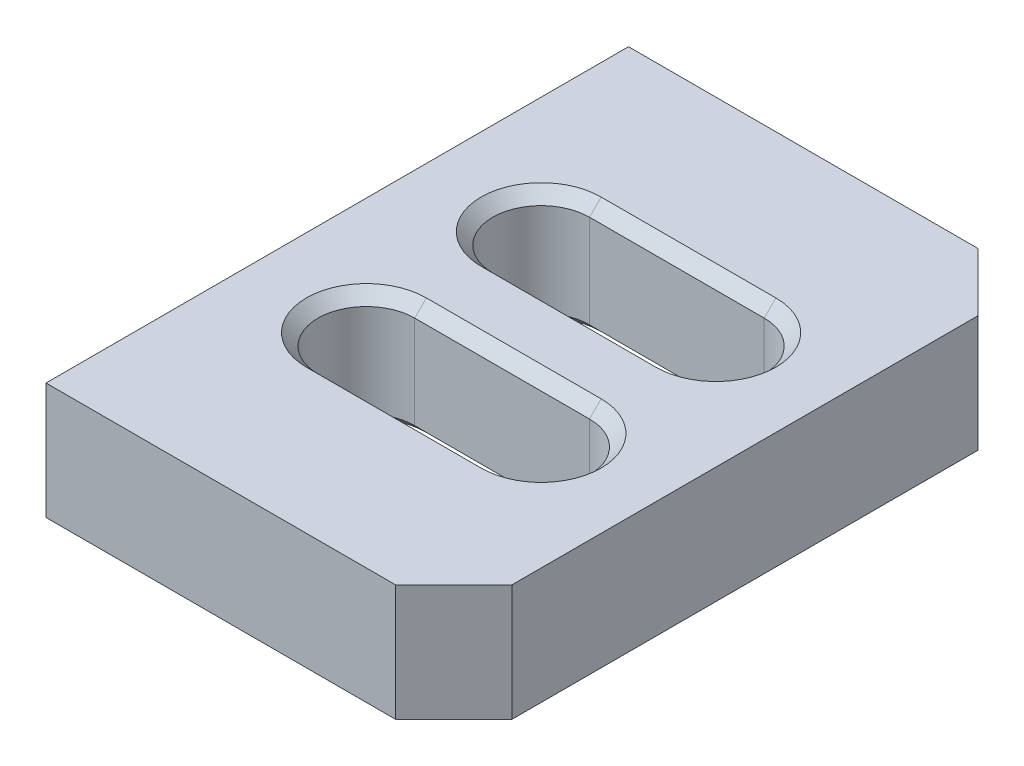
ISO-10303-21;
HEADER;
FILE_DESCRIPTION(('STEP AP214'),'2;1');
FILE_NAME('part.step','',(''),(''),'','','');
FILE_SCHEMA(('AUTOMOTIVE_DESIGN { 1 0 10303 214 1 1 1 1 }'));
ENDSEC;
DATA;
#1=APPLICATION_CONTEXT('core data for automotive mechanical design processes');
#2=APPLICATION_PROTOCOL_DEFINITION('international standard','automotive_design',2000,#1);
#3=PRODUCT_CONTEXT('',#1,'mechanical');
#4=PRODUCT('Part','Part','',(#3));
#5=PRODUCT_RELATED_PRODUCT_CATEGORY('part','',(#4));
#6=PRODUCT_DEFINITION_FORMATION('','',#4);
#7=PRODUCT_DEFINITION_CONTEXT('part definition',#1,'design');
#8=PRODUCT_DEFINITION('design','',#6,#7);
#9=PRODUCT_DEFINITION_SHAPE('','',#8);
#10=(LENGTH_UNIT() NAMED_UNIT(*) SI_UNIT(.MILLI.,.METRE.));
#11=(NAMED_UNIT(*) PLANE_ANGLE_UNIT() SI_UNIT($,.RADIAN.));
#12=(NAMED_UNIT(*) SI_UNIT($,.STERADIAN.) SOLID_ANGLE_UNIT());
#13=UNCERTAINTY_MEASURE_WITH_UNIT(LENGTH_MEASURE(1.E-05),#10,'distance_accuracy_value','');
#14=(GEOMETRIC_REPRESENTATION_CONTEXT(3) GLOBAL_UNCERTAINTY_ASSIGNED_CONTEXT((#13)) GLOBAL_UNIT_ASSIGNED_CONTEXT((#10,
#11,#12)) REPRESENTATION_CONTEXT('',''));
#15=CARTESIAN_POINT('',(0.,0.,0.));
#16=DIRECTION('',(0.,0.,1.));
#17=DIRECTION('',(1.,0.,0.));
#18=AXIS2_PLACEMENT_3D('',#15,#16,#17);
#19=CARTESIAN_POINT('',(35.,10.,-5.));
#20=DIRECTION('',(-0.707106781186547,0.,-0.707106781186548));
#21=DIRECTION('',(-0.707106781186548,0.,0.707106781186547));
#22=AXIS2_PLACEMENT_3D('',#19,#20,#21);
#23=PLANE('',#22);
#24=DIRECTION('',(0.707106781186548,0.,-0.707106781186547));
#25=VECTOR('',#24,1.);
#26=CARTESIAN_POINT('',(35.,10.,-5.));
#27=LINE('',#26,#25);
#28=CARTESIAN_POINT('',(30.,10.,0.));
#29=VERTEX_POINT('',#28);
#30=CARTESIAN_POINT('',(35.,10.,-5.));
#31=VERTEX_POINT('',#30);
#32=EDGE_CURVE('E405',#29,#31,#27,.T.);
#33=ORIENTED_EDGE('',*,*,#32,.F.);
#34=DIRECTION('',(0.,1.,0.));
#35=VECTOR('',#34,1.);
#36=CARTESIAN_POINT('',(30.,10.,0.));
#37=LINE('',#36,#35);
#38=CARTESIAN_POINT('',(30.,0.,0.));
#39=VERTEX_POINT('',#38);
#40=EDGE_CURVE('E368',#39,#29,#37,.T.);
#41=ORIENTED_EDGE('',*,*,#40,.F.);
#42=DIRECTION('',(-0.707106781186548,0.,0.707106781186547));
#43=VECTOR('',#42,1.);
#44=CARTESIAN_POINT('',(15.,0.,15.));
#45=LINE('',#44,#43);
#46=CARTESIAN_POINT('',(35.,0.,-5.));
#47=VERTEX_POINT('',#46);
#48=EDGE_CURVE('E437',#47,#39,#45,.T.);
#49=ORIENTED_EDGE('',*,*,#48,.F.);
#50=DIRECTION('',(0.,-1.,0.));
#51=VECTOR('',#50,1.);
#52=CARTESIAN_POINT('',(35.,10.,-5.));
#53=LINE('',#52,#51);
#54=EDGE_CURVE('E353',#31,#47,#53,.T.);
#55=ORIENTED_EDGE('',*,*,#54,.F.);
#56=EDGE_LOOP('',(#33,#41,#49,#55));
#57=FACE_BOUND('',#56,.T.);
#58=ADVANCED_FACE('F17',(#57),#23,.F.);
#59=CARTESIAN_POINT('',(30.,10.,-50.));
#60=DIRECTION('',(-0.707106781186549,0.,0.707106781186546));
#61=DIRECTION('',(0.,1.,0.));
#62=AXIS2_PLACEMENT_3D('',#59,#60,#61);
#63=PLANE('',#62);
#64=DIRECTION('',(-0.707106781186546,0.,-0.707106781186549));
#65=VECTOR('',#64,1.);
#66=CARTESIAN_POINT('',(30.,10.,-50.));
#67=LINE('',#66,#65);
#68=CARTESIAN_POINT('',(35.,10.,-45.));
#69=VERTEX_POINT('',#68);
#70=CARTESIAN_POINT('',(30.,10.,-50.));
#71=VERTEX_POINT('',#70);
#72=EDGE_CURVE('E266',#69,#71,#67,.T.);
#73=ORIENTED_EDGE('',*,*,#72,.F.);
#74=DIRECTION('',(0.,1.,0.));
#75=VECTOR('',#74,1.);
#76=CARTESIAN_POINT('',(35.,10.,-45.));
#77=LINE('',#76,#75);
#78=CARTESIAN_POINT('',(35.,0.,-45.));
#79=VERTEX_POINT('',#78);
#80=EDGE_CURVE('E298',#79,#69,#77,.T.);
#81=ORIENTED_EDGE('',*,*,#80,.F.);
#82=DIRECTION('',(0.707106781186546,0.,0.707106781186549));
#83=VECTOR('',#82,1.);
#84=CARTESIAN_POINT('',(40.,0.,-40.));
#85=LINE('',#84,#83);
#86=CARTESIAN_POINT('',(30.,0.,-50.));
#87=VERTEX_POINT('',#86);
#88=EDGE_CURVE('E441',#87,#79,#85,.T.);
#89=ORIENTED_EDGE('',*,*,#88,.F.);
#90=DIRECTION('',(0.,-1.,0.));
#91=VECTOR('',#90,1.);
#92=CARTESIAN_POINT('',(30.,10.,-50.));
#93=LINE('',#92,#91);
#94=EDGE_CURVE('E262',#71,#87,#93,.T.);
#95=ORIENTED_EDGE('',*,*,#94,.F.);
#96=EDGE_LOOP('',(#73,#81,#89,#95));
#97=FACE_BOUND('',#96,.T.);
#98=ADVANCED_FACE('F618',(#97),#63,.F.);
#99=CARTESIAN_POINT('',(10.,9.,-32.5));
#100=DIRECTION('',(0.,1.,0.));
#101=DIRECTION('',(0.,0.,1.));
#102=AXIS2_PLACEMENT_3D('',#99,#100,#101);
#103=CONICAL_SURFACE('',#102,4.15,0.785398163397452);
#104=DIRECTION('',(0.,0.707106781186546,-0.707106781186549));
#105=VECTOR('',#104,1.);
#106=CARTESIAN_POINT('',(10.,9.,-36.65));
#107=LINE('',#106,#105);
#108=CARTESIAN_POINT('',(10.,9.,-36.65));
#109=VERTEX_POINT('',#108);
#110=CARTESIAN_POINT('',(10.,10.,-37.65));
#111=VERTEX_POINT('',#110);
#112=EDGE_CURVE('E26',#109,#111,#107,.T.);
#113=ORIENTED_EDGE('',*,*,#112,.T.);
#114=CARTESIAN_POINT('',(10.,10.,-32.5));
#115=DIRECTION('',(0.,-1.,0.));
#116=DIRECTION('',(0.,0.,-1.));
#117=AXIS2_PLACEMENT_3D('',#114,#115,#116);
#118=CIRCLE('',#117,5.15);
#119=CARTESIAN_POINT('',(10.,10.,-27.35));
#120=VERTEX_POINT('',#119);
#121=EDGE_CURVE('E399',#120,#111,#118,.T.);
#122=ORIENTED_EDGE('',*,*,#121,.F.);
#123=DIRECTION('',(0.,-0.707106781186545,-0.70710678118655));
#124=VECTOR('',#123,1.);
#125=CARTESIAN_POINT('',(10.,10.,-27.35));
#126=LINE('',#125,#124);
#127=CARTESIAN_POINT('',(10.,9.,-28.35));
#128=VERTEX_POINT('',#127);
#129=EDGE_CURVE('E11',#120,#128,#126,.T.);
#130=ORIENTED_EDGE('',*,*,#129,.T.);
#131=CARTESIAN_POINT('',(10.,9.,-32.5));
#132=DIRECTION('',(0.,1.,0.));
#133=DIRECTION('',(0.,0.,-1.));
#134=AXIS2_PLACEMENT_3D('',#131,#132,#133);
#135=CIRCLE('',#134,4.15);
#136=EDGE_CURVE('E292',#109,#128,#135,.T.);
#137=ORIENTED_EDGE('',*,*,#136,.F.);
#138=EDGE_LOOP('',(#113,#122,#130,#137));
#139=FACE_BOUND('',#138,.T.);
#140=ADVANCED_FACE('F599',(#139),#103,.F.);
#141=CARTESIAN_POINT('',(25.,9.,-28.35));
#142=DIRECTION('',(0.,-0.70710678118655,0.707106781186545));
#143=DIRECTION('',(-1.,0.,0.));
#144=AXIS2_PLACEMENT_3D('',#141,#142,#143);
#145=PLANE('',#144);
#146=DIRECTION('',(0.,-0.707106781186545,-0.70710678118655));
#147=VECTOR('',#146,1.);
#148=CARTESIAN_POINT('',(25.,10.,-27.35));
#149=LINE('',#148,#147);
#150=CARTESIAN_POINT('',(25.,10.,-27.35));
#151=VERTEX_POINT('',#150);
#152=CARTESIAN_POINT('',(25.,9.,-28.35));
#153=VERTEX_POINT('',#152);
#154=EDGE_CURVE('E20',#151,#153,#149,.T.);
#155=ORIENTED_EDGE('',*,*,#154,.T.);
#156=DIRECTION('',(1.,0.,0.));
#157=VECTOR('',#156,1.);
#158=CARTESIAN_POINT('',(25.,9.,-28.35));
#159=LINE('',#158,#157);
#160=EDGE_CURVE('E398',#128,#153,#159,.T.);
#161=ORIENTED_EDGE('',*,*,#160,.F.);
#162=ORIENTED_EDGE('',*,*,#129,.F.);
#163=DIRECTION('',(-1.,0.,0.));
#164=VECTOR('',#163,1.);
#165=CARTESIAN_POINT('',(0.,10.,-27.35));
#166=LINE('',#165,#164);
#167=EDGE_CURVE('E404',#151,#120,#166,.T.);
#168=ORIENTED_EDGE('',*,*,#167,.F.);
#169=EDGE_LOOP('',(#155,#161,#162,#168));
#170=FACE_BOUND('',#169,.T.);
#171=ADVANCED_FACE('F567',(#170),#145,.F.);
#172=CARTESIAN_POINT('',(25.,9.,-36.65));
#173=DIRECTION('',(0.,-0.707106781186548,-0.707106781186547));
#174=DIRECTION('',(0.,0.707106781186547,-0.707106781186548));
#175=AXIS2_PLACEMENT_3D('',#172,#173,#174);
#176=PLANE('',#175);
#177=DIRECTION('',(0.,0.707106781186546,-0.707106781186549));
#178=VECTOR('',#177,1.);
#179=CARTESIAN_POINT('',(25.,9.,-36.65));
#180=LINE('',#179,#178);
#181=CARTESIAN_POINT('',(25.,9.,-36.65));
#182=VERTEX_POINT('',#181);
#183=CARTESIAN_POINT('',(25.,10.,-37.65));
#184=VERTEX_POINT('',#183);
#185=EDGE_CURVE('E464',#182,#184,#180,.T.);
#186=ORIENTED_EDGE('',*,*,#185,.T.);
#187=DIRECTION('',(1.,0.,0.));
#188=VECTOR('',#187,1.);
#189=CARTESIAN_POINT('',(0.,10.,-37.65));
#190=LINE('',#189,#188);
#191=EDGE_CURVE('E403',#111,#184,#190,.T.);
#192=ORIENTED_EDGE('',*,*,#191,.F.);
#193=ORIENTED_EDGE('',*,*,#112,.F.);
#194=DIRECTION('',(-1.,0.,0.));
#195=VECTOR('',#194,1.);
#196=CARTESIAN_POINT('',(25.,9.,-36.65));
#197=LINE('',#196,#195);
#198=EDGE_CURVE('E433',#182,#109,#197,.T.);
#199=ORIENTED_EDGE('',*,*,#198,.F.);
#200=EDGE_LOOP('',(#186,#192,#193,#199));
#201=FACE_BOUND('',#200,.T.);
#202=ADVANCED_FACE('F650',(#201),#176,.F.);
#203=CARTESIAN_POINT('',(25.,9.,-32.5));
#204=DIRECTION('',(0.,1.,0.));
#205=DIRECTION('',(0.,0.,1.));
#206=AXIS2_PLACEMENT_3D('',#203,#204,#205);
#207=CONICAL_SURFACE('',#206,4.15,0.785398163397452);
#208=ORIENTED_EDGE('',*,*,#154,.F.);
#209=CARTESIAN_POINT('',(25.,10.,-32.5));
#210=DIRECTION('',(0.,-1.,0.));
#211=DIRECTION('',(0.,0.,-1.));
#212=AXIS2_PLACEMENT_3D('',#209,#210,#211);
#213=CIRCLE('',#212,5.15);
#214=EDGE_CURVE('E442',#184,#151,#213,.T.);
#215=ORIENTED_EDGE('',*,*,#214,.F.);
#216=ORIENTED_EDGE('',*,*,#185,.F.);
#217=CARTESIAN_POINT('',(25.,9.,-32.5));
#218=DIRECTION('',(0.,1.,0.));
#219=DIRECTION('',(0.,0.,-1.));
#220=AXIS2_PLACEMENT_3D('',#217,#218,#219);
#221=CIRCLE('',#220,4.15);
#222=EDGE_CURVE('E360',#153,#182,#221,.T.);
#223=ORIENTED_EDGE('',*,*,#222,.F.);
#224=EDGE_LOOP('',(#208,#215,#216,#223));
#225=FACE_BOUND('',#224,.T.);
#226=ADVANCED_FACE('F575',(#225),#207,.F.);
#227=CARTESIAN_POINT('',(10.,9.,-17.5));
#228=DIRECTION('',(0.,1.,0.));
#229=DIRECTION('',(0.,0.,1.));
#230=AXIS2_PLACEMENT_3D('',#227,#228,#229);
#231=CONICAL_SURFACE('',#230,4.15,0.785398163397452);
#232=DIRECTION('',(0.,0.707106781186545,-0.70710678118655));
#233=VECTOR('',#232,1.);
#234=CARTESIAN_POINT('',(10.,9.,-21.65));
#235=LINE('',#234,#233);
#236=CARTESIAN_POINT('',(10.,9.,-21.65));
#237=VERTEX_POINT('',#236);
#238=CARTESIAN_POINT('',(10.,10.,-22.65));
#239=VERTEX_POINT('',#238);
#240=EDGE_CURVE('E519',#237,#239,#235,.T.);
#241=ORIENTED_EDGE('',*,*,#240,.T.);
#242=CARTESIAN_POINT('',(10.,10.,-17.5));
#243=DIRECTION('',(0.,-1.,0.));
#244=DIRECTION('',(0.,0.,-1.));
#245=AXIS2_PLACEMENT_3D('',#242,#243,#244);
#246=CIRCLE('',#245,5.15);
#247=CARTESIAN_POINT('',(10.,10.,-12.35));
#248=VERTEX_POINT('',#247);
#249=EDGE_CURVE('E416',#248,#239,#246,.T.);
#250=ORIENTED_EDGE('',*,*,#249,.F.);
#251=DIRECTION('',(0.,-0.707106781186545,-0.70710678118655));
#252=VECTOR('',#251,1.);
#253=CARTESIAN_POINT('',(10.,10.,-12.35));
#254=LINE('',#253,#252);
#255=CARTESIAN_POINT('',(10.,9.,-13.35));
#256=VERTEX_POINT('',#255);
#257=EDGE_CURVE('E554',#248,#256,#254,.T.);
#258=ORIENTED_EDGE('',*,*,#257,.T.);
#259=CARTESIAN_POINT('',(10.,9.,-17.5));
#260=DIRECTION('',(0.,1.,0.));
#261=DIRECTION('',(0.,0.,-1.));
#262=AXIS2_PLACEMENT_3D('',#259,#260,#261);
#263=CIRCLE('',#262,4.15);
#264=EDGE_CURVE('E421',#237,#256,#263,.T.);
#265=ORIENTED_EDGE('',*,*,#264,.F.);
#266=EDGE_LOOP('',(#241,#250,#258,#265));
#267=FACE_BOUND('',#266,.T.);
#268=ADVANCED_FACE('F653',(#267),#231,.F.);
#269=CARTESIAN_POINT('',(25.,9.,-13.35));
#270=DIRECTION('',(0.,-0.70710678118655,0.707106781186545));
#271=DIRECTION('',(-1.,0.,0.));
#272=AXIS2_PLACEMENT_3D('',#269,#270,#271);
#273=PLANE('',#272);
#274=DIRECTION('',(0.,-0.707106781186545,-0.70710678118655));
#275=VECTOR('',#274,1.);
#276=CARTESIAN_POINT('',(25.,10.,-12.35));
#277=LINE('',#276,#275);
#278=CARTESIAN_POINT('',(25.,10.,-12.35));
#279=VERTEX_POINT('',#278);
#280=CARTESIAN_POINT('',(25.,9.,-13.35));
#281=VERTEX_POINT('',#280);
#282=EDGE_CURVE('E520',#279,#281,#277,.T.);
#283=ORIENTED_EDGE('',*,*,#282,.T.);
#284=DIRECTION('',(1.,0.,0.));
#285=VECTOR('',#284,1.);
#286=CARTESIAN_POINT('',(25.,9.,-13.35));
#287=LINE('',#286,#285);
#288=EDGE_CURVE('E328',#256,#281,#287,.T.);
#289=ORIENTED_EDGE('',*,*,#288,.F.);
#290=ORIENTED_EDGE('',*,*,#257,.F.);
#291=DIRECTION('',(-1.,0.,0.));
#292=VECTOR('',#291,1.);
#293=CARTESIAN_POINT('',(0.,10.,-12.35));
#294=LINE('',#293,#292);
#295=EDGE_CURVE('E408',#279,#248,#294,.T.);
#296=ORIENTED_EDGE('',*,*,#295,.F.);
#297=EDGE_LOOP('',(#283,#289,#290,#296));
#298=FACE_BOUND('',#297,.T.);
#299=ADVANCED_FACE('F656',(#298),#273,.F.);
#300=CARTESIAN_POINT('',(25.,9.,-21.65));
#301=DIRECTION('',(0.,-0.70710678118655,-0.707106781186546));
#302=DIRECTION('',(0.,0.707106781186546,-0.70710678118655));
#303=AXIS2_PLACEMENT_3D('',#300,#301,#302);
#304=PLANE('',#303);
#305=DIRECTION('',(0.,0.707106781186545,-0.70710678118655));
#306=VECTOR('',#305,1.);
#307=CARTESIAN_POINT('',(25.,9.,-21.65));
#308=LINE('',#307,#306);
#309=CARTESIAN_POINT('',(25.,9.,-21.65));
#310=VERTEX_POINT('',#309);
#311=CARTESIAN_POINT('',(25.,10.,-22.65));
#312=VERTEX_POINT('',#311);
#313=EDGE_CURVE('E516',#310,#312,#308,.T.);
#314=ORIENTED_EDGE('',*,*,#313,.T.);
#315=DIRECTION('',(1.,0.,0.));
#316=VECTOR('',#315,1.);
#317=CARTESIAN_POINT('',(0.,10.,-22.65));
#318=LINE('',#317,#316);
#319=EDGE_CURVE('E420',#239,#312,#318,.T.);
#320=ORIENTED_EDGE('',*,*,#319,.F.);
#321=ORIENTED_EDGE('',*,*,#240,.F.);
#322=DIRECTION('',(-1.,0.,0.));
#323=VECTOR('',#322,1.);
#324=CARTESIAN_POINT('',(25.,9.,-21.65));
#325=LINE('',#324,#323);
#326=EDGE_CURVE('E533',#310,#237,#325,.T.);
#327=ORIENTED_EDGE('',*,*,#326,.F.);
#328=EDGE_LOOP('',(#314,#320,#321,#327));
#329=FACE_BOUND('',#328,.T.);
#330=ADVANCED_FACE('F659',(#329),#304,.F.);
#331=CARTESIAN_POINT('',(25.,9.,-17.5));
#332=DIRECTION('',(0.,1.,0.));
#333=DIRECTION('',(0.,0.,1.));
#334=AXIS2_PLACEMENT_3D('',#331,#332,#333);
#335=CONICAL_SURFACE('',#334,4.15,0.785398163397452);
#336=ORIENTED_EDGE('',*,*,#282,.F.);
#337=CARTESIAN_POINT('',(25.,10.,-17.5));
#338=DIRECTION('',(0.,-1.,0.));
#339=DIRECTION('',(0.,0.,-1.));
#340=AXIS2_PLACEMENT_3D('',#337,#338,#339);
#341=CIRCLE('',#340,5.15);
#342=EDGE_CURVE('E412',#312,#279,#341,.T.);
#343=ORIENTED_EDGE('',*,*,#342,.F.);
#344=ORIENTED_EDGE('',*,*,#313,.F.);
#345=CARTESIAN_POINT('',(25.,9.,-17.5));
#346=DIRECTION('',(0.,1.,0.));
#347=DIRECTION('',(0.,0.,-1.));
#348=AXIS2_PLACEMENT_3D('',#345,#346,#347);
#349=CIRCLE('',#348,4.15);
#350=EDGE_CURVE('E358',#281,#310,#349,.T.);
#351=ORIENTED_EDGE('',*,*,#350,.F.);
#352=EDGE_LOOP('',(#336,#343,#344,#351));
#353=FACE_BOUND('',#352,.T.);
#354=ADVANCED_FACE('F663',(#353),#335,.F.);
#355=CARTESIAN_POINT('',(25.,1.,-28.35));
#356=DIRECTION('',(0.,-0.707106781186552,-0.707106781186543));
#357=DIRECTION('',(0.,0.707106781186543,-0.707106781186552));
#358=AXIS2_PLACEMENT_3D('',#355,#356,#357);
#359=PLANE('',#358);
#360=DIRECTION('',(0.,-0.707106781186544,0.707106781186552));
#361=VECTOR('',#360,1.);
#362=CARTESIAN_POINT('',(25.,1.,-28.35));
#363=LINE('',#362,#361);
#364=CARTESIAN_POINT('',(25.,1.,-28.35));
#365=VERTEX_POINT('',#364);
#366=CARTESIAN_POINT('',(25.,0.,-27.35));
#367=VERTEX_POINT('',#366);
#368=EDGE_CURVE('E345',#365,#367,#363,.T.);
#369=ORIENTED_EDGE('',*,*,#368,.T.);
#370=DIRECTION('',(1.,0.,0.));
#371=VECTOR('',#370,1.);
#372=CARTESIAN_POINT('',(25.,0.,-27.35));
#373=LINE('',#372,#371);
#374=CARTESIAN_POINT('',(10.,0.,-27.35));
#375=VERTEX_POINT('',#374);
#376=EDGE_CURVE('E468',#375,#367,#373,.T.);
#377=ORIENTED_EDGE('',*,*,#376,.F.);
#378=DIRECTION('',(0.,0.707106781186542,-0.707106781186553));
#379=VECTOR('',#378,1.);
#380=CARTESIAN_POINT('',(10.,0.,-27.35));
#381=LINE('',#380,#379);
#382=CARTESIAN_POINT('',(10.,1.,-28.35));
#383=VERTEX_POINT('',#382);
#384=EDGE_CURVE('E348',#375,#383,#381,.T.);
#385=ORIENTED_EDGE('',*,*,#384,.T.);
#386=DIRECTION('',(-1.,0.,0.));
#387=VECTOR('',#386,1.);
#388=CARTESIAN_POINT('',(10.,1.,-28.35));
#389=LINE('',#388,#387);
#390=EDGE_CURVE('E364',#365,#383,#389,.T.);
#391=ORIENTED_EDGE('',*,*,#390,.F.);
#392=EDGE_LOOP('',(#369,#377,#385,#391));
#393=FACE_BOUND('',#392,.T.);
#394=ADVANCED_FACE('F588',(#393),#359,.T.);
#395=CARTESIAN_POINT('',(10.,1.,-32.5));
#396=DIRECTION('',(0.,-1.,0.));
#397=DIRECTION('',(0.,0.,-1.));
#398=AXIS2_PLACEMENT_3D('',#395,#396,#397);
#399=CONICAL_SURFACE('',#398,4.15,0.785398163397455);
#400=DIRECTION('',(0.,0.707106781186545,0.70710678118655));
#401=VECTOR('',#400,1.);
#402=CARTESIAN_POINT('',(10.,0.,-37.65));
#403=LINE('',#402,#401);
#404=CARTESIAN_POINT('',(10.,0.,-37.65));
#405=VERTEX_POINT('',#404);
#406=CARTESIAN_POINT('',(10.,1.,-36.65));
#407=VERTEX_POINT('',#406);
#408=EDGE_CURVE('E544',#405,#407,#403,.T.);
#409=ORIENTED_EDGE('',*,*,#408,.T.);
#410=CARTESIAN_POINT('',(10.,1.,-32.5));
#411=DIRECTION('',(0.,-1.,0.));
#412=DIRECTION('',(0.,0.,-1.));
#413=AXIS2_PLACEMENT_3D('',#410,#411,#412);
#414=CIRCLE('',#413,4.15);
#415=EDGE_CURVE('E307',#383,#407,#414,.T.);
#416=ORIENTED_EDGE('',*,*,#415,.F.);
#417=ORIENTED_EDGE('',*,*,#384,.F.);
#418=CARTESIAN_POINT('',(10.,0.,-32.5));
#419=DIRECTION('',(0.,1.,0.));
#420=DIRECTION('',(0.,0.,-1.));
#421=AXIS2_PLACEMENT_3D('',#418,#419,#420);
#422=CIRCLE('',#421,5.15);
#423=EDGE_CURVE('E388',#405,#375,#422,.T.);
#424=ORIENTED_EDGE('',*,*,#423,.F.);
#425=EDGE_LOOP('',(#409,#416,#417,#424));
#426=FACE_BOUND('',#425,.T.);
#427=ADVANCED_FACE('F592',(#426),#399,.F.);
#428=CARTESIAN_POINT('',(25.,1.,-32.5));
#429=DIRECTION('',(0.,-1.,0.));
#430=DIRECTION('',(0.,0.,-1.));
#431=AXIS2_PLACEMENT_3D('',#428,#429,#430);
#432=CONICAL_SURFACE('',#431,4.15,0.785398163397454);
#433=DIRECTION('',(0.,-0.707106781186545,-0.70710678118655));
#434=VECTOR('',#433,1.);
#435=CARTESIAN_POINT('',(25.,1.,-36.65));
#436=LINE('',#435,#434);
#437=CARTESIAN_POINT('',(25.,1.,-36.65));
#438=VERTEX_POINT('',#437);
#439=CARTESIAN_POINT('',(25.,0.,-37.65));
#440=VERTEX_POINT('',#439);
#441=EDGE_CURVE('E349',#438,#440,#436,.T.);
#442=ORIENTED_EDGE('',*,*,#441,.T.);
#443=CARTESIAN_POINT('',(25.,0.,-32.5));
#444=DIRECTION('',(0.,1.,0.));
#445=DIRECTION('',(0.,0.,-1.));
#446=AXIS2_PLACEMENT_3D('',#443,#444,#445);
#447=CIRCLE('',#446,5.15);
#448=EDGE_CURVE('E472',#367,#440,#447,.T.);
#449=ORIENTED_EDGE('',*,*,#448,.F.);
#450=ORIENTED_EDGE('',*,*,#368,.F.);
#451=CARTESIAN_POINT('',(25.,1.,-32.5));
#452=DIRECTION('',(0.,-1.,0.));
#453=DIRECTION('',(0.,0.,-1.));
#454=AXIS2_PLACEMENT_3D('',#451,#452,#453);
#455=CIRCLE('',#454,4.15);
#456=EDGE_CURVE('E314',#438,#365,#455,.T.);
#457=ORIENTED_EDGE('',*,*,#456,.F.);
#458=EDGE_LOOP('',(#442,#449,#450,#457));
#459=FACE_BOUND('',#458,.T.);
#460=ADVANCED_FACE('F582',(#459),#432,.F.);
#461=CARTESIAN_POINT('',(25.,1.,-36.65));
#462=DIRECTION('',(0.,-0.70710678118655,0.707106781186546));
#463=DIRECTION('',(-1.,0.,0.));
#464=AXIS2_PLACEMENT_3D('',#461,#462,#463);
#465=PLANE('',#464);
#466=ORIENTED_EDGE('',*,*,#408,.F.);
#467=DIRECTION('',(-1.,0.,0.));
#468=VECTOR('',#467,1.);
#469=CARTESIAN_POINT('',(10.,0.,-37.65));
#470=LINE('',#469,#468);
#471=EDGE_CURVE('E476',#440,#405,#470,.T.);
#472=ORIENTED_EDGE('',*,*,#471,.F.);
#473=ORIENTED_EDGE('',*,*,#441,.F.);
#474=DIRECTION('',(1.,0.,0.));
#475=VECTOR('',#474,1.);
#476=CARTESIAN_POINT('',(25.,1.,-36.65));
#477=LINE('',#476,#475);
#478=EDGE_CURVE('E295',#407,#438,#477,.T.);
#479=ORIENTED_EDGE('',*,*,#478,.F.);
#480=EDGE_LOOP('',(#466,#472,#473,#479));
#481=FACE_BOUND('',#480,.T.);
#482=ADVANCED_FACE('F672',(#481),#465,.T.);
#483=CARTESIAN_POINT('',(25.,1.,-13.35));
#484=DIRECTION('',(0.,-0.707106781186552,-0.707106781186544));
#485=DIRECTION('',(0.,0.707106781186544,-0.707106781186552));
#486=AXIS2_PLACEMENT_3D('',#483,#484,#485);
#487=PLANE('',#486);
#488=DIRECTION('',(0.,-0.707106781186544,0.707106781186552));
#489=VECTOR('',#488,1.);
#490=CARTESIAN_POINT('',(25.,1.,-13.35));
#491=LINE('',#490,#489);
#492=CARTESIAN_POINT('',(25.,1.,-13.35));
#493=VERTEX_POINT('',#492);
#494=CARTESIAN_POINT('',(25.,0.,-12.35));
#495=VERTEX_POINT('',#494);
#496=EDGE_CURVE('E376',#493,#495,#491,.T.);
#497=ORIENTED_EDGE('',*,*,#496,.T.);
#498=DIRECTION('',(1.,0.,0.));
#499=VECTOR('',#498,1.);
#500=CARTESIAN_POINT('',(25.,0.,-12.35));
#501=LINE('',#500,#499);
#502=CARTESIAN_POINT('',(10.,0.,-12.35));
#503=VERTEX_POINT('',#502);
#504=EDGE_CURVE('E451',#503,#495,#501,.T.);
#505=ORIENTED_EDGE('',*,*,#504,.F.);
#506=DIRECTION('',(0.,0.707106781186544,-0.707106781186551));
#507=VECTOR('',#506,1.);
#508=CARTESIAN_POINT('',(10.,0.,-12.35));
#509=LINE('',#508,#507);
#510=CARTESIAN_POINT('',(10.,1.,-13.35));
#511=VERTEX_POINT('',#510);
#512=EDGE_CURVE('E541',#503,#511,#509,.T.);
#513=ORIENTED_EDGE('',*,*,#512,.T.);
#514=DIRECTION('',(-1.,0.,0.));
#515=VECTOR('',#514,1.);
#516=CARTESIAN_POINT('',(10.,1.,-13.35));
#517=LINE('',#516,#515);
#518=EDGE_CURVE('E452',#493,#511,#517,.T.);
#519=ORIENTED_EDGE('',*,*,#518,.F.);
#520=EDGE_LOOP('',(#497,#505,#513,#519));
#521=FACE_BOUND('',#520,.T.);
#522=ADVANCED_FACE('F675',(#521),#487,.T.);
#523=CARTESIAN_POINT('',(10.,1.,-17.5));
#524=DIRECTION('',(0.,-1.,0.));
#525=DIRECTION('',(0.,0.,-1.));
#526=AXIS2_PLACEMENT_3D('',#523,#524,#525);
#527=CONICAL_SURFACE('',#526,4.15,0.785398163397453);
#528=DIRECTION('',(0.,0.707106781186544,0.707106781186552));
#529=VECTOR('',#528,1.);
#530=CARTESIAN_POINT('',(10.,0.,-22.65));
#531=LINE('',#530,#529);
#532=CARTESIAN_POINT('',(10.,0.,-22.65));
#533=VERTEX_POINT('',#532);
#534=CARTESIAN_POINT('',(10.,1.,-21.65));
#535=VERTEX_POINT('',#534);
#536=EDGE_CURVE('E377',#533,#535,#531,.T.);
#537=ORIENTED_EDGE('',*,*,#536,.T.);
#538=CARTESIAN_POINT('',(10.,1.,-17.5));
#539=DIRECTION('',(0.,-1.,0.));
#540=DIRECTION('',(0.,0.,-1.));
#541=AXIS2_PLACEMENT_3D('',#538,#539,#540);
#542=CIRCLE('',#541,4.15);
#543=EDGE_CURVE('E323',#511,#535,#542,.T.);
#544=ORIENTED_EDGE('',*,*,#543,.F.);
#545=ORIENTED_EDGE('',*,*,#512,.F.);
#546=CARTESIAN_POINT('',(10.,0.,-17.5));
#547=DIRECTION('',(0.,1.,0.));
#548=DIRECTION('',(0.,0.,-1.));
#549=AXIS2_PLACEMENT_3D('',#546,#547,#548);
#550=CIRCLE('',#549,5.15);
#551=EDGE_CURVE('E440',#533,#503,#550,.T.);
#552=ORIENTED_EDGE('',*,*,#551,.F.);
#553=EDGE_LOOP('',(#537,#544,#545,#552));
#554=FACE_BOUND('',#553,.T.);
#555=ADVANCED_FACE('F681',(#554),#527,.F.);
#556=CARTESIAN_POINT('',(25.,1.,-17.5));
#557=DIRECTION('',(0.,-1.,0.));
#558=DIRECTION('',(0.,0.,-1.));
#559=AXIS2_PLACEMENT_3D('',#556,#557,#558);
#560=CONICAL_SURFACE('',#559,4.15,0.785398163397454);
#561=DIRECTION('',(0.,-0.707106781186544,-0.707106781186552));
#562=VECTOR('',#561,1.);
#563=CARTESIAN_POINT('',(25.,1.,-21.65));
#564=LINE('',#563,#562);
#565=CARTESIAN_POINT('',(25.,1.,-21.65));
#566=VERTEX_POINT('',#565);
#567=CARTESIAN_POINT('',(25.,0.,-22.65));
#568=VERTEX_POINT('',#567);
#569=EDGE_CURVE('E373',#566,#568,#564,.T.);
#570=ORIENTED_EDGE('',*,*,#569,.T.);
#571=CARTESIAN_POINT('',(25.,0.,-17.5));
#572=DIRECTION('',(0.,1.,0.));
#573=DIRECTION('',(0.,0.,-1.));
#574=AXIS2_PLACEMENT_3D('',#571,#572,#573);
#575=CIRCLE('',#574,5.15);
#576=EDGE_CURVE('E389',#495,#568,#575,.T.);
#577=ORIENTED_EDGE('',*,*,#576,.F.);
#578=ORIENTED_EDGE('',*,*,#496,.F.);
#579=CARTESIAN_POINT('',(25.,1.,-17.5));
#580=DIRECTION('',(0.,-1.,0.));
#581=DIRECTION('',(0.,0.,-1.));
#582=AXIS2_PLACEMENT_3D('',#579,#580,#581);
#583=CIRCLE('',#582,4.15);
#584=EDGE_CURVE('E359',#566,#493,#583,.T.);
#585=ORIENTED_EDGE('',*,*,#584,.F.);
#586=EDGE_LOOP('',(#570,#577,#578,#585));
#587=FACE_BOUND('',#586,.T.);
#588=ADVANCED_FACE('F685',(#587),#560,.F.);
#589=CARTESIAN_POINT('',(25.,1.,-21.65));
#590=DIRECTION('',(0.,-0.707106781186551,0.707106781186544));
#591=DIRECTION('',(-1.,0.,0.));
#592=AXIS2_PLACEMENT_3D('',#589,#590,#591);
#593=PLANE('',#592);
#594=ORIENTED_EDGE('',*,*,#536,.F.);
#595=DIRECTION('',(-1.,0.,0.));
#596=VECTOR('',#595,1.);
#597=CARTESIAN_POINT('',(10.,0.,-22.65));
#598=LINE('',#597,#596);
#599=EDGE_CURVE('E384',#568,#533,#598,.T.);
#600=ORIENTED_EDGE('',*,*,#599,.F.);
#601=ORIENTED_EDGE('',*,*,#569,.F.);
#602=DIRECTION('',(1.,0.,0.));
#603=VECTOR('',#602,1.);
#604=CARTESIAN_POINT('',(25.,1.,-21.65));
#605=LINE('',#604,#603);
#606=EDGE_CURVE('E425',#535,#566,#605,.T.);
#607=ORIENTED_EDGE('',*,*,#606,.F.);
#608=EDGE_LOOP('',(#594,#600,#601,#607));
#609=FACE_BOUND('',#608,.T.);
#610=ADVANCED_FACE('F689',(#609),#593,.T.);
#611=CARTESIAN_POINT('',(25.,-2.,-21.65));
#612=DIRECTION('',(0.,0.,-1.));
#613=DIRECTION('',(-1.,0.,0.));
#614=AXIS2_PLACEMENT_3D('',#611,#612,#613);
#615=PLANE('',#614);
#616=DIRECTION('',(0.,1.,0.));
#617=VECTOR('',#616,1.);
#618=CARTESIAN_POINT('',(10.,-2.,-21.65));
#619=LINE('',#618,#617);
#620=EDGE_CURVE('E327',#535,#237,#619,.T.);
#621=ORIENTED_EDGE('',*,*,#620,.F.);
#622=ORIENTED_EDGE('',*,*,#606,.T.);
#623=DIRECTION('',(0.,1.,0.));
#624=VECTOR('',#623,1.);
#625=CARTESIAN_POINT('',(25.,-2.,-21.65));
#626=LINE('',#625,#624);
#627=EDGE_CURVE('E429',#566,#310,#626,.T.);
#628=ORIENTED_EDGE('',*,*,#627,.T.);
#629=ORIENTED_EDGE('',*,*,#326,.T.);
#630=EDGE_LOOP('',(#621,#622,#628,#629));
#631=FACE_BOUND('',#630,.T.);
#632=ADVANCED_FACE('F693',(#631),#615,.F.);
#633=CARTESIAN_POINT('',(10.,-2.,-17.5));
#634=DIRECTION('',(0.,1.,0.));
#635=DIRECTION('',(0.,0.,1.));
#636=AXIS2_PLACEMENT_3D('',#633,#634,#635);
#637=CYLINDRICAL_SURFACE('',#636,4.15);
#638=DIRECTION('',(0.,1.,0.));
#639=VECTOR('',#638,1.);
#640=CARTESIAN_POINT('',(10.,-2.,-13.35));
#641=LINE('',#640,#639);
#642=EDGE_CURVE('E342',#511,#256,#641,.T.);
#643=ORIENTED_EDGE('',*,*,#642,.F.);
#644=ORIENTED_EDGE('',*,*,#543,.T.);
#645=ORIENTED_EDGE('',*,*,#620,.T.);
#646=ORIENTED_EDGE('',*,*,#264,.T.);
#647=EDGE_LOOP('',(#643,#644,#645,#646));
#648=FACE_BOUND('',#647,.T.);
#649=ADVANCED_FACE('F697',(#648),#637,.F.);
#650=CARTESIAN_POINT('',(25.,-2.,-13.35));
#651=DIRECTION('',(0.,0.,1.));
#652=DIRECTION('',(1.,0.,0.));
#653=AXIS2_PLACEMENT_3D('',#650,#651,#652);
#654=PLANE('',#653);
#655=DIRECTION('',(0.,1.,0.));
#656=VECTOR('',#655,1.);
#657=CARTESIAN_POINT('',(25.,-2.,-13.35));
#658=LINE('',#657,#656);
#659=EDGE_CURVE('E354',#493,#281,#658,.T.);
#660=ORIENTED_EDGE('',*,*,#659,.F.);
#661=ORIENTED_EDGE('',*,*,#518,.T.);
#662=ORIENTED_EDGE('',*,*,#642,.T.);
#663=ORIENTED_EDGE('',*,*,#288,.T.);
#664=EDGE_LOOP('',(#660,#661,#662,#663));
#665=FACE_BOUND('',#664,.T.);
#666=ADVANCED_FACE('F701',(#665),#654,.F.);
#667=CARTESIAN_POINT('',(25.,-2.,-17.5));
#668=DIRECTION('',(0.,1.,0.));
#669=DIRECTION('',(0.,0.,1.));
#670=AXIS2_PLACEMENT_3D('',#667,#668,#669);
#671=CYLINDRICAL_SURFACE('',#670,4.15);
#672=ORIENTED_EDGE('',*,*,#627,.F.);
#673=ORIENTED_EDGE('',*,*,#584,.T.);
#674=ORIENTED_EDGE('',*,*,#659,.T.);
#675=ORIENTED_EDGE('',*,*,#350,.T.);
#676=EDGE_LOOP('',(#672,#673,#674,#675));
#677=FACE_BOUND('',#676,.T.);
#678=ADVANCED_FACE('F705',(#677),#671,.F.);
#679=CARTESIAN_POINT('',(25.,-2.,-36.65));
#680=DIRECTION('',(0.,0.,-1.));
#681=DIRECTION('',(-1.,0.,0.));
#682=AXIS2_PLACEMENT_3D('',#679,#680,#681);
#683=PLANE('',#682);
#684=DIRECTION('',(0.,1.,0.));
#685=VECTOR('',#684,1.);
#686=CARTESIAN_POINT('',(10.,-2.,-36.65));
#687=LINE('',#686,#685);
#688=EDGE_CURVE('E296',#407,#109,#687,.T.);
#689=ORIENTED_EDGE('',*,*,#688,.F.);
#690=ORIENTED_EDGE('',*,*,#478,.T.);
#691=DIRECTION('',(0.,1.,0.));
#692=VECTOR('',#691,1.);
#693=CARTESIAN_POINT('',(25.,-2.,-36.65));
#694=LINE('',#693,#692);
#695=EDGE_CURVE('E310',#438,#182,#694,.T.);
#696=ORIENTED_EDGE('',*,*,#695,.T.);
#697=ORIENTED_EDGE('',*,*,#198,.T.);
#698=EDGE_LOOP('',(#689,#690,#696,#697));
#699=FACE_BOUND('',#698,.T.);
#700=ADVANCED_FACE('F709',(#699),#683,.F.);
#701=CARTESIAN_POINT('',(10.,-2.,-32.5));
#702=DIRECTION('',(0.,1.,0.));
#703=DIRECTION('',(0.,0.,1.));
#704=AXIS2_PLACEMENT_3D('',#701,#702,#703);
#705=CYLINDRICAL_SURFACE('',#704,4.15);
#706=DIRECTION('',(0.,1.,0.));
#707=VECTOR('',#706,1.);
#708=CARTESIAN_POINT('',(10.,-2.,-28.35));
#709=LINE('',#708,#707);
#710=EDGE_CURVE('E498',#383,#128,#709,.T.);
#711=ORIENTED_EDGE('',*,*,#710,.F.);
#712=ORIENTED_EDGE('',*,*,#415,.T.);
#713=ORIENTED_EDGE('',*,*,#688,.T.);
#714=ORIENTED_EDGE('',*,*,#136,.T.);
#715=EDGE_LOOP('',(#711,#712,#713,#714));
#716=FACE_BOUND('',#715,.T.);
#717=ADVANCED_FACE('F595',(#716),#705,.F.);
#718=CARTESIAN_POINT('',(25.,-2.,-28.35));
#719=DIRECTION('',(0.,0.,1.));
#720=DIRECTION('',(1.,0.,0.));
#721=AXIS2_PLACEMENT_3D('',#718,#719,#720);
#722=PLANE('',#721);
#723=DIRECTION('',(0.,1.,0.));
#724=VECTOR('',#723,1.);
#725=CARTESIAN_POINT('',(25.,-2.,-28.35));
#726=LINE('',#725,#724);
#727=EDGE_CURVE('E365',#365,#153,#726,.T.);
#728=ORIENTED_EDGE('',*,*,#727,.F.);
#729=ORIENTED_EDGE('',*,*,#390,.T.);
#730=ORIENTED_EDGE('',*,*,#710,.T.);
#731=ORIENTED_EDGE('',*,*,#160,.T.);
#732=EDGE_LOOP('',(#728,#729,#730,#731));
#733=FACE_BOUND('',#732,.T.);
#734=ADVANCED_FACE('F573',(#733),#722,.F.);
#735=CARTESIAN_POINT('',(25.,-2.,-32.5));
#736=DIRECTION('',(0.,1.,0.));
#737=DIRECTION('',(0.,0.,1.));
#738=AXIS2_PLACEMENT_3D('',#735,#736,#737);
#739=CYLINDRICAL_SURFACE('',#738,4.15);
#740=ORIENTED_EDGE('',*,*,#695,.F.);
#741=ORIENTED_EDGE('',*,*,#456,.T.);
#742=ORIENTED_EDGE('',*,*,#727,.T.);
#743=ORIENTED_EDGE('',*,*,#222,.T.);
#744=EDGE_LOOP('',(#740,#741,#742,#743));
#745=FACE_BOUND('',#744,.T.);
#746=ADVANCED_FACE('F579',(#745),#739,.F.);
#747=CARTESIAN_POINT('',(0.,5.,-25.));
#748=DIRECTION('',(-1.,0.,0.));
#749=DIRECTION('',(0.,0.,1.));
#750=AXIS2_PLACEMENT_3D('',#747,#748,#749);
#751=CONICAL_SURFACE('',#750,3.025,0.78539816339745);
#752=CARTESIAN_POINT('',(0.525,5.,-25.));
#753=DIRECTION('',(-1.,0.,0.));
#754=DIRECTION('',(0.,0.,1.));
#755=AXIS2_PLACEMENT_3D('',#752,#753,#754);
#756=CIRCLE('',#755,2.5);
#757=CARTESIAN_POINT('',(0.525,5.,-22.5));
#758=VERTEX_POINT('',#757);
#759=EDGE_CURVE('E315',#758,#758,#756,.T.);
#760=ORIENTED_EDGE('',*,*,#759,.F.);
#761=EDGE_LOOP('',(#760));
#762=FACE_BOUND('',#761,.T.);
#763=CARTESIAN_POINT('',(0.,5.,-25.));
#764=DIRECTION('',(-1.,0.,0.));
#765=DIRECTION('',(0.,0.,1.));
#766=AXIS2_PLACEMENT_3D('',#763,#764,#765);
#767=CIRCLE('',#766,3.025);
#768=CARTESIAN_POINT('',(0.,5.,-21.975));
#769=VERTEX_POINT('',#768);
#770=EDGE_CURVE('E276',#769,#769,#767,.T.);
#771=ORIENTED_EDGE('',*,*,#770,.T.);
#772=EDGE_LOOP('',(#771));
#773=FACE_BOUND('',#772,.T.);
#774=ADVANCED_FACE('F722',(#762,#773),#751,.F.);
#775=CARTESIAN_POINT('',(0.,5.,-25.));
#776=DIRECTION('',(-1.,0.,0.));
#777=DIRECTION('',(0.,0.,1.));
#778=AXIS2_PLACEMENT_3D('',#775,#776,#777);
#779=CYLINDRICAL_SURFACE('',#778,2.5);
#780=CARTESIAN_POINT('',(20.,5.,-25.));
#781=DIRECTION('',(-1.,0.,0.));
#782=DIRECTION('',(0.,0.,1.));
#783=AXIS2_PLACEMENT_3D('',#780,#781,#782);
#784=CIRCLE('',#783,2.5);
#785=CARTESIAN_POINT('',(20.,5.,-22.5));
#786=VERTEX_POINT('',#785);
#787=EDGE_CURVE('E318',#786,#786,#784,.T.);
#788=ORIENTED_EDGE('',*,*,#787,.F.);
#789=EDGE_LOOP('',(#788));
#790=FACE_BOUND('',#789,.T.);
#791=ORIENTED_EDGE('',*,*,#759,.T.);
#792=EDGE_LOOP('',(#791));
#793=FACE_BOUND('',#792,.T.);
#794=ADVANCED_FACE('F718',(#790,#793),#779,.F.);
#795=CARTESIAN_POINT('',(20.,5.,-25.));
#796=DIRECTION('',(-1.,0.,0.));
#797=DIRECTION('',(0.,0.,1.));
#798=AXIS2_PLACEMENT_3D('',#795,#796,#797);
#799=CONICAL_SURFACE('',#798,2.5,1.02974425867665);
#800=CARTESIAN_POINT('',(21.5021515475689,5.,-25.));
#801=VERTEX_POINT('',#800);
#802=VERTEX_LOOP('',#801);
#803=FACE_BOUND('',#802,.T.);
#804=ORIENTED_EDGE('',*,*,#787,.T.);
#805=EDGE_LOOP('',(#804));
#806=FACE_BOUND('',#805,.T.);
#807=ADVANCED_FACE('F721',(#803,#806),#799,.F.);
#808=CARTESIAN_POINT('',(0.,5.,-40.));
#809=DIRECTION('',(-1.,0.,0.));
#810=DIRECTION('',(0.,0.,1.));
#811=AXIS2_PLACEMENT_3D('',#808,#809,#810);
#812=CONICAL_SURFACE('',#811,3.025,0.785398163397448);
#813=CARTESIAN_POINT('',(0.525,5.,-40.));
#814=DIRECTION('',(-1.,0.,0.));
#815=DIRECTION('',(0.,0.,1.));
#816=AXIS2_PLACEMENT_3D('',#813,#814,#815);
#817=CIRCLE('',#816,2.5);
#818=CARTESIAN_POINT('',(0.525,5.,-37.5));
#819=VERTEX_POINT('',#818);
#820=EDGE_CURVE('E332',#819,#819,#817,.T.);
#821=ORIENTED_EDGE('',*,*,#820,.F.);
#822=EDGE_LOOP('',(#821));
#823=FACE_BOUND('',#822,.T.);
#824=CARTESIAN_POINT('',(0.,5.,-40.));
#825=DIRECTION('',(-1.,0.,0.));
#826=DIRECTION('',(0.,0.,1.));
#827=AXIS2_PLACEMENT_3D('',#824,#825,#826);
#828=CIRCLE('',#827,3.025);
#829=CARTESIAN_POINT('',(0.,5.,-36.975));
#830=VERTEX_POINT('',#829);
#831=EDGE_CURVE('E319',#830,#830,#828,.T.);
#832=ORIENTED_EDGE('',*,*,#831,.T.);
#833=EDGE_LOOP('',(#832));
#834=FACE_BOUND('',#833,.T.);
#835=ADVANCED_FACE('F724',(#823,#834),#812,.F.);
#836=CARTESIAN_POINT('',(0.,5.,-40.));
#837=DIRECTION('',(-1.,0.,0.));
#838=DIRECTION('',(0.,0.,1.));
#839=AXIS2_PLACEMENT_3D('',#836,#837,#838);
#840=CYLINDRICAL_SURFACE('',#839,2.5);
#841=CARTESIAN_POINT('',(20.,5.,-40.));
#842=DIRECTION('',(-1.,0.,0.));
#843=DIRECTION('',(0.,0.,1.));
#844=AXIS2_PLACEMENT_3D('',#841,#842,#843);
#845=CIRCLE('',#844,2.5);
#846=CARTESIAN_POINT('',(20.,5.,-37.5));
#847=VERTEX_POINT('',#846);
#848=EDGE_CURVE('E329',#847,#847,#845,.T.);
#849=ORIENTED_EDGE('',*,*,#848,.F.);
#850=EDGE_LOOP('',(#849));
#851=FACE_BOUND('',#850,.T.);
#852=ORIENTED_EDGE('',*,*,#820,.T.);
#853=EDGE_LOOP('',(#852));
#854=FACE_BOUND('',#853,.T.);
#855=ADVANCED_FACE('F727',(#851,#854),#840,.F.);
#856=CARTESIAN_POINT('',(20.,5.,-40.));
#857=DIRECTION('',(-1.,0.,0.));
#858=DIRECTION('',(0.,0.,1.));
#859=AXIS2_PLACEMENT_3D('',#856,#857,#858);
#860=CONICAL_SURFACE('',#859,2.5,1.02974425867665);
#861=CARTESIAN_POINT('',(21.5021515475689,5.,-40.));
#862=VERTEX_POINT('',#861);
#863=VERTEX_LOOP('',#862);
#864=FACE_BOUND('',#863,.T.);
#865=ORIENTED_EDGE('',*,*,#848,.T.);
#866=EDGE_LOOP('',(#865));
#867=FACE_BOUND('',#866,.T.);
#868=ADVANCED_FACE('F729',(#864,#867),#860,.F.);
#869=CARTESIAN_POINT('',(0.,5.,-10.));
#870=DIRECTION('',(-1.,0.,0.));
#871=DIRECTION('',(0.,0.,1.));
#872=AXIS2_PLACEMENT_3D('',#869,#870,#871);
#873=CONICAL_SURFACE('',#872,3.025,0.785398163397448);
#874=CARTESIAN_POINT('',(0.525,5.,-10.));
#875=DIRECTION('',(-1.,0.,0.));
#876=DIRECTION('',(0.,0.,1.));
#877=AXIS2_PLACEMENT_3D('',#874,#875,#876);
#878=CIRCLE('',#877,2.5);
#879=CARTESIAN_POINT('',(0.525,5.,-7.5));
#880=VERTEX_POINT('',#879);
#881=EDGE_CURVE('E333',#880,#880,#878,.T.);
#882=ORIENTED_EDGE('',*,*,#881,.F.);
#883=EDGE_LOOP('',(#882));
#884=FACE_BOUND('',#883,.T.);
#885=CARTESIAN_POINT('',(0.,5.,-10.));
#886=DIRECTION('',(-1.,0.,0.));
#887=DIRECTION('',(0.,0.,1.));
#888=AXIS2_PLACEMENT_3D('',#885,#886,#887);
#889=CIRCLE('',#888,3.025);
#890=CARTESIAN_POINT('',(0.,5.,-6.975));
#891=VERTEX_POINT('',#890);
#892=EDGE_CURVE('E322',#891,#891,#889,.T.);
#893=ORIENTED_EDGE('',*,*,#892,.T.);
#894=EDGE_LOOP('',(#893));
#895=FACE_BOUND('',#894,.T.);
#896=ADVANCED_FACE('F732',(#884,#895),#873,.F.);
#897=CARTESIAN_POINT('',(0.,5.,-10.));
#898=DIRECTION('',(-1.,0.,0.));
#899=DIRECTION('',(0.,0.,1.));
#900=AXIS2_PLACEMENT_3D('',#897,#898,#899);
#901=CYLINDRICAL_SURFACE('',#900,2.5);
#902=CARTESIAN_POINT('',(20.,5.,-10.));
#903=DIRECTION('',(-1.,0.,0.));
#904=DIRECTION('',(0.,0.,1.));
#905=AXIS2_PLACEMENT_3D('',#902,#903,#904);
#906=CIRCLE('',#905,2.5);
#907=CARTESIAN_POINT('',(20.,5.,-7.5));
#908=VERTEX_POINT('',#907);
#909=EDGE_CURVE('E480',#908,#908,#906,.T.);
#910=ORIENTED_EDGE('',*,*,#909,.F.);
#911=EDGE_LOOP('',(#910));
#912=FACE_BOUND('',#911,.T.);
#913=ORIENTED_EDGE('',*,*,#881,.T.);
#914=EDGE_LOOP('',(#913));
#915=FACE_BOUND('',#914,.T.);
#916=ADVANCED_FACE('F733',(#912,#915),#901,.F.);
#917=CARTESIAN_POINT('',(20.,5.,-10.));
#918=DIRECTION('',(-1.,0.,0.));
#919=DIRECTION('',(0.,0.,1.));
#920=AXIS2_PLACEMENT_3D('',#917,#918,#919);
#921=CONICAL_SURFACE('',#920,2.5,1.02974425867665);
#922=CARTESIAN_POINT('',(21.5021515475689,5.,-10.));
#923=VERTEX_POINT('',#922);
#924=VERTEX_LOOP('',#923);
#925=FACE_BOUND('',#924,.T.);
#926=ORIENTED_EDGE('',*,*,#909,.T.);
#927=EDGE_LOOP('',(#926));
#928=FACE_BOUND('',#927,.T.);
#929=ADVANCED_FACE('F736',(#925,#928),#921,.F.);
#930=CARTESIAN_POINT('',(0.,0.,0.));
#931=DIRECTION('',(0.,-1.,0.));
#932=DIRECTION('',(0.,0.,-1.));
#933=AXIS2_PLACEMENT_3D('',#930,#931,#932);
#934=PLANE('',#933);
#935=ORIENTED_EDGE('',*,*,#423,.T.);
#936=ORIENTED_EDGE('',*,*,#376,.T.);
#937=ORIENTED_EDGE('',*,*,#448,.T.);
#938=ORIENTED_EDGE('',*,*,#471,.T.);
#939=EDGE_LOOP('',(#935,#936,#937,#938));
#940=FACE_BOUND('',#939,.T.);
#941=ORIENTED_EDGE('',*,*,#551,.T.);
#942=ORIENTED_EDGE('',*,*,#504,.T.);
#943=ORIENTED_EDGE('',*,*,#576,.T.);
#944=ORIENTED_EDGE('',*,*,#599,.T.);
#945=EDGE_LOOP('',(#941,#942,#943,#944));
#946=FACE_BOUND('',#945,.T.);
#947=DIRECTION('',(-1.,0.,0.));
#948=VECTOR('',#947,1.);
#949=CARTESIAN_POINT('',(0.,0.,-50.));
#950=LINE('',#949,#948);
#951=CARTESIAN_POINT('',(0.,0.,-50.));
#952=VERTEX_POINT('',#951);
#953=EDGE_CURVE('E255',#87,#952,#950,.T.);
#954=ORIENTED_EDGE('',*,*,#953,.F.);
#955=ORIENTED_EDGE('',*,*,#88,.T.);
#956=DIRECTION('',(0.,0.,-1.));
#957=VECTOR('',#956,1.);
#958=CARTESIAN_POINT('',(35.,0.,0.));
#959=LINE('',#958,#957);
#960=EDGE_CURVE('E302',#47,#79,#959,.T.);
#961=ORIENTED_EDGE('',*,*,#960,.F.);
#962=ORIENTED_EDGE('',*,*,#48,.T.);
#963=DIRECTION('',(1.,0.,0.));
#964=VECTOR('',#963,1.);
#965=CARTESIAN_POINT('',(0.,0.,0.));
#966=LINE('',#965,#964);
#967=CARTESIAN_POINT('',(0.,0.,0.));
#968=VERTEX_POINT('',#967);
#969=EDGE_CURVE('E280',#968,#39,#966,.T.);
#970=ORIENTED_EDGE('',*,*,#969,.F.);
#971=DIRECTION('',(0.,0.,1.));
#972=VECTOR('',#971,1.);
#973=CARTESIAN_POINT('',(0.,0.,0.));
#974=LINE('',#973,#972);
#975=EDGE_CURVE('E272',#952,#968,#974,.T.);
#976=ORIENTED_EDGE('',*,*,#975,.F.);
#977=EDGE_LOOP('',(#954,#955,#961,#962,#970,#976));
#978=FACE_BOUND('',#977,.T.);
#979=ADVANCED_FACE('F278',(#940,#946,#978),#934,.T.);
#980=CARTESIAN_POINT('',(0.,10.,0.));
#981=DIRECTION('',(0.,-1.,0.));
#982=DIRECTION('',(0.,0.,-1.));
#983=AXIS2_PLACEMENT_3D('',#980,#981,#982);
#984=PLANE('',#983);
#985=ORIENTED_EDGE('',*,*,#167,.T.);
#986=ORIENTED_EDGE('',*,*,#121,.T.);
#987=ORIENTED_EDGE('',*,*,#191,.T.);
#988=ORIENTED_EDGE('',*,*,#214,.T.);
#989=EDGE_LOOP('',(#985,#986,#987,#988));
#990=FACE_BOUND('',#989,.T.);
#991=ORIENTED_EDGE('',*,*,#295,.T.);
#992=ORIENTED_EDGE('',*,*,#249,.T.);
#993=ORIENTED_EDGE('',*,*,#319,.T.);
#994=ORIENTED_EDGE('',*,*,#342,.T.);
#995=EDGE_LOOP('',(#991,#992,#993,#994));
#996=FACE_BOUND('',#995,.T.);
#997=DIRECTION('',(0.,0.,-1.));
#998=VECTOR('',#997,1.);
#999=CARTESIAN_POINT('',(35.,10.,0.));
#1000=LINE('',#999,#998);
#1001=EDGE_CURVE('E301',#31,#69,#1000,.T.);
#1002=ORIENTED_EDGE('',*,*,#1001,.T.);
#1003=ORIENTED_EDGE('',*,*,#72,.T.);
#1004=DIRECTION('',(-1.,0.,0.));
#1005=VECTOR('',#1004,1.);
#1006=CARTESIAN_POINT('',(0.,10.,-50.));
#1007=LINE('',#1006,#1005);
#1008=CARTESIAN_POINT('',(0.,10.,-50.));
#1009=VERTEX_POINT('',#1008);
#1010=EDGE_CURVE('E338',#71,#1009,#1007,.T.);
#1011=ORIENTED_EDGE('',*,*,#1010,.T.);
#1012=DIRECTION('',(0.,0.,1.));
#1013=VECTOR('',#1012,1.);
#1014=CARTESIAN_POINT('',(0.,10.,0.));
#1015=LINE('',#1014,#1013);
#1016=CARTESIAN_POINT('',(0.,10.,0.));
#1017=VERTEX_POINT('',#1016);
#1018=EDGE_CURVE('E274',#1009,#1017,#1015,.T.);
#1019=ORIENTED_EDGE('',*,*,#1018,.T.);
#1020=DIRECTION('',(1.,0.,0.));
#1021=VECTOR('',#1020,1.);
#1022=CARTESIAN_POINT('',(0.,10.,0.));
#1023=LINE('',#1022,#1021);
#1024=EDGE_CURVE('E372',#1017,#29,#1023,.T.);
#1025=ORIENTED_EDGE('',*,*,#1024,.T.);
#1026=ORIENTED_EDGE('',*,*,#32,.T.);
#1027=EDGE_LOOP('',(#1002,#1003,#1011,#1019,#1025,#1026));
#1028=FACE_BOUND('',#1027,.T.);
#1029=ADVANCED_FACE('F604',(#990,#996,#1028),#984,.F.);
#1030=CARTESIAN_POINT('',(0.,10.,-50.));
#1031=DIRECTION('',(0.,0.,1.));
#1032=DIRECTION('',(1.,0.,0.));
#1033=AXIS2_PLACEMENT_3D('',#1030,#1031,#1032);
#1034=PLANE('',#1033);
#1035=ORIENTED_EDGE('',*,*,#1010,.F.);
#1036=ORIENTED_EDGE('',*,*,#94,.T.);
#1037=ORIENTED_EDGE('',*,*,#953,.T.);
#1038=DIRECTION('',(0.,-1.,0.));
#1039=VECTOR('',#1038,1.);
#1040=CARTESIAN_POINT('',(0.,10.,-50.));
#1041=LINE('',#1040,#1039);
#1042=EDGE_CURVE('E259',#1009,#952,#1041,.T.);
#1043=ORIENTED_EDGE('',*,*,#1042,.F.);
#1044=EDGE_LOOP('',(#1035,#1036,#1037,#1043));
#1045=FACE_BOUND('',#1044,.T.);
#1046=ADVANCED_FACE('F258',(#1045),#1034,.F.);
#1047=CARTESIAN_POINT('',(35.,10.,0.));
#1048=DIRECTION('',(-1.,0.,0.));
#1049=DIRECTION('',(0.,0.,1.));
#1050=AXIS2_PLACEMENT_3D('',#1047,#1048,#1049);
#1051=PLANE('',#1050);
#1052=ORIENTED_EDGE('',*,*,#960,.T.);
#1053=ORIENTED_EDGE('',*,*,#80,.T.);
#1054=ORIENTED_EDGE('',*,*,#1001,.F.);
#1055=ORIENTED_EDGE('',*,*,#54,.T.);
#1056=EDGE_LOOP('',(#1052,#1053,#1054,#1055));
#1057=FACE_BOUND('',#1056,.T.);
#1058=ADVANCED_FACE('F622',(#1057),#1051,.F.);
#1059=CARTESIAN_POINT('',(0.,10.,0.));
#1060=DIRECTION('',(0.,0.,-1.));
#1061=DIRECTION('',(0.,-1.,0.));
#1062=AXIS2_PLACEMENT_3D('',#1059,#1060,#1061);
#1063=PLANE('',#1062);
#1064=ORIENTED_EDGE('',*,*,#969,.T.);
#1065=ORIENTED_EDGE('',*,*,#40,.T.);
#1066=ORIENTED_EDGE('',*,*,#1024,.F.);
#1067=DIRECTION('',(0.,-1.,0.));
#1068=VECTOR('',#1067,1.);
#1069=CARTESIAN_POINT('',(0.,10.,0.));
#1070=LINE('',#1069,#1068);
#1071=EDGE_CURVE('E283',#1017,#968,#1070,.T.);
#1072=ORIENTED_EDGE('',*,*,#1071,.T.);
#1073=EDGE_LOOP('',(#1064,#1065,#1066,#1072));
#1074=FACE_BOUND('',#1073,.T.);
#1075=ADVANCED_FACE('F626',(#1074),#1063,.F.);
#1076=CARTESIAN_POINT('',(0.,10.,0.));
#1077=DIRECTION('',(1.,0.,0.));
#1078=DIRECTION('',(0.,1.,0.));
#1079=AXIS2_PLACEMENT_3D('',#1076,#1077,#1078);
#1080=PLANE('',#1079);
#1081=ORIENTED_EDGE('',*,*,#892,.F.);
#1082=EDGE_LOOP('',(#1081));
#1083=FACE_BOUND('',#1082,.T.);
#1084=ORIENTED_EDGE('',*,*,#831,.F.);
#1085=EDGE_LOOP('',(#1084));
#1086=FACE_BOUND('',#1085,.T.);
#1087=ORIENTED_EDGE('',*,*,#770,.F.);
#1088=EDGE_LOOP('',(#1087));
#1089=FACE_BOUND('',#1088,.T.);
#1090=ORIENTED_EDGE('',*,*,#975,.T.);
#1091=ORIENTED_EDGE('',*,*,#1071,.F.);
#1092=ORIENTED_EDGE('',*,*,#1018,.F.);
#1093=ORIENTED_EDGE('',*,*,#1042,.T.);
#1094=EDGE_LOOP('',(#1090,#1091,#1092,#1093));
#1095=FACE_BOUND('',#1094,.T.);
#1096=ADVANCED_FACE('F270',(#1083,#1086,#1089,#1095),#1080,.F.);
#1097=CLOSED_SHELL('',(#58,#98,#140,#171,#202,#226,#268,#299,#330,#354,#394,#427,#460,#482,#522,
#555,#588,#610,#632,#649,#666,#678,#700,#717,#734,#746,#774,#794,#807,#835,#855,#868,#896,#916,
#929,#979,#1029,#1046,#1058,#1075,#1096));
#1098=MANIFOLD_SOLID_BREP('B1',#1097);
#1099=ADVANCED_BREP_SHAPE_REPRESENTATION('',(#18,#1098),#14);
#1100=SHAPE_DEFINITION_REPRESENTATION(#9,#1099);
ENDSEC;
END-ISO-10303-21;
